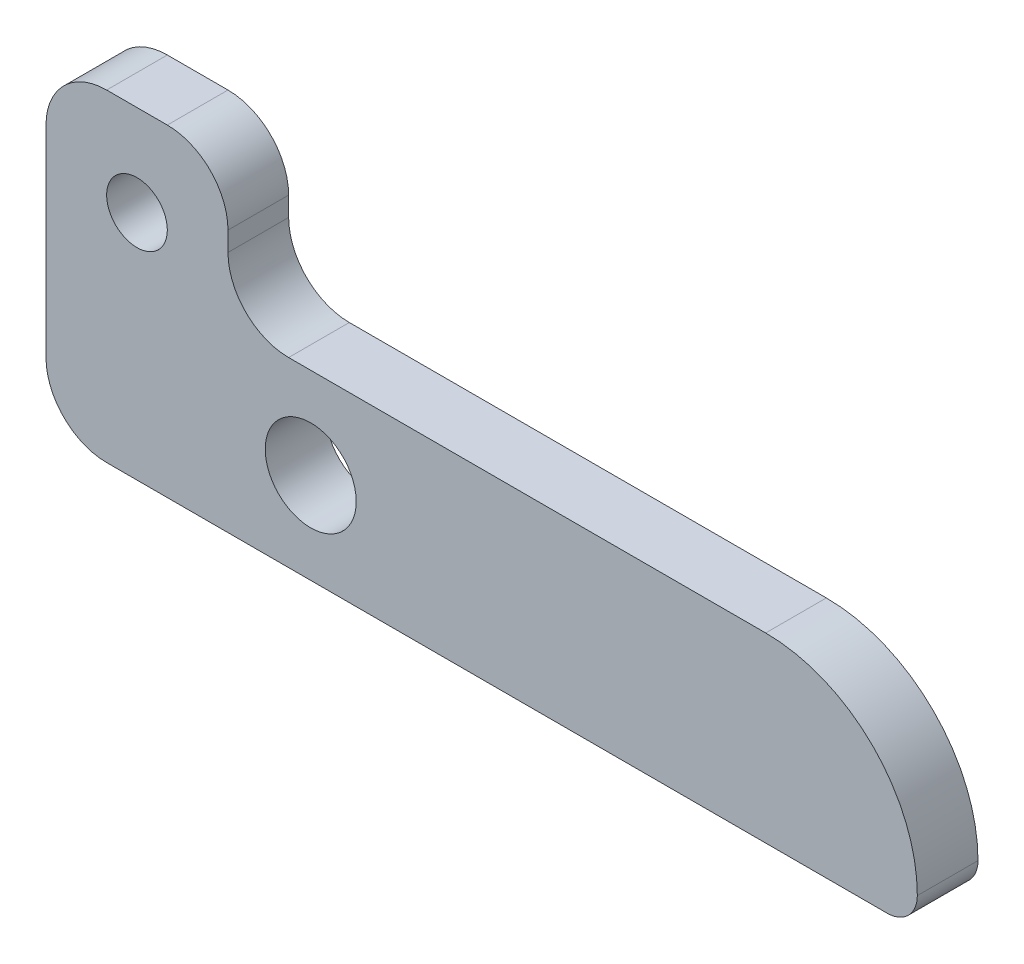
ISO-10303-21;
HEADER;
FILE_DESCRIPTION(('STEP AP214'),'2;1');
FILE_NAME('part.step','',(''),(''),'','','');
FILE_SCHEMA(('AUTOMOTIVE_DESIGN { 1 0 10303 214 1 1 1 1 }'));
ENDSEC;
DATA;
#1=APPLICATION_CONTEXT('core data for automotive mechanical design processes');
#2=APPLICATION_PROTOCOL_DEFINITION('international standard','automotive_design',2000,#1);
#3=PRODUCT_CONTEXT('',#1,'mechanical');
#4=PRODUCT('Part','Part','',(#3));
#5=PRODUCT_RELATED_PRODUCT_CATEGORY('part','',(#4));
#6=PRODUCT_DEFINITION_FORMATION('','',#4);
#7=PRODUCT_DEFINITION_CONTEXT('part definition',#1,'design');
#8=PRODUCT_DEFINITION('design','',#6,#7);
#9=PRODUCT_DEFINITION_SHAPE('','',#8);
#10=(LENGTH_UNIT() NAMED_UNIT(*) SI_UNIT(.MILLI.,.METRE.));
#11=(NAMED_UNIT(*) PLANE_ANGLE_UNIT() SI_UNIT($,.RADIAN.));
#12=(NAMED_UNIT(*) SI_UNIT($,.STERADIAN.) SOLID_ANGLE_UNIT());
#13=UNCERTAINTY_MEASURE_WITH_UNIT(LENGTH_MEASURE(1.E-05),#10,'distance_accuracy_value','');
#14=(GEOMETRIC_REPRESENTATION_CONTEXT(3) GLOBAL_UNCERTAINTY_ASSIGNED_CONTEXT((#13)) GLOBAL_UNIT_ASSIGNED_CONTEXT((#10,
#11,#12)) REPRESENTATION_CONTEXT('',''));
#15=CARTESIAN_POINT('',(0.,0.,0.));
#16=DIRECTION('',(0.,0.,1.));
#17=DIRECTION('',(1.,0.,0.));
#18=AXIS2_PLACEMENT_3D('',#15,#16,#17);
#19=CARTESIAN_POINT('',(0.,0.,2.));
#20=DIRECTION('',(0.,0.,1.));
#21=DIRECTION('',(1.,0.,0.));
#22=AXIS2_PLACEMENT_3D('',#19,#20,#21);
#23=PLANE('',#22);
#24=CARTESIAN_POINT('',(0.559814768951123,166.712259216357,2.));
#25=DIRECTION('',(0.,0.,1.));
#26=DIRECTION('',(1.,0.,0.));
#27=AXIS2_PLACEMENT_3D('',#24,#25,#26);
#28=CIRCLE('',#27,1.5);
#29=CARTESIAN_POINT('',(2.05981476895112,166.712259216357,2.));
#30=VERTEX_POINT('',#29);
#31=EDGE_CURVE('E217',#30,#30,#28,.T.);
#32=ORIENTED_EDGE('',*,*,#31,.F.);
#33=EDGE_LOOP('',(#32));
#34=FACE_BOUND('',#33,.T.);
#35=DIRECTION('',(0.,1.,0.));
#36=VECTOR('',#35,1.);
#37=CARTESIAN_POINT('',(-2.16775096698678,169.712259216357,2.));
#38=LINE('',#37,#36);
#39=CARTESIAN_POINT('',(-2.16775096698678,171.712259216357,2.));
#40=VERTEX_POINT('',#39);
#41=CARTESIAN_POINT('',(-2.16775096698678,172.350350498395,2.));
#42=VERTEX_POINT('',#41);
#43=EDGE_CURVE('E211',#40,#42,#38,.T.);
#44=ORIENTED_EDGE('',*,*,#43,.T.);
#45=CARTESIAN_POINT('',(-4.16775096698678,172.350350498395,2.));
#46=DIRECTION('',(0.,0.,1.));
#47=DIRECTION('',(1.,0.,0.));
#48=AXIS2_PLACEMENT_3D('',#45,#46,#47);
#49=CIRCLE('',#48,2.);
#50=CARTESIAN_POINT('',(-4.16775096698678,174.350350498395,2.));
#51=VERTEX_POINT('',#50);
#52=EDGE_CURVE('E187',#42,#51,#49,.T.);
#53=ORIENTED_EDGE('',*,*,#52,.T.);
#54=DIRECTION('',(-1.,0.,0.));
#55=VECTOR('',#54,1.);
#56=CARTESIAN_POINT('',(-2.16775096698678,174.350350498395,2.));
#57=LINE('',#56,#55);
#58=CARTESIAN_POINT('',(-6.16775096698678,174.350350498395,2.));
#59=VERTEX_POINT('',#58);
#60=EDGE_CURVE('E137',#51,#59,#57,.T.);
#61=ORIENTED_EDGE('',*,*,#60,.T.);
#62=CARTESIAN_POINT('',(-6.16775096698678,172.350350498395,2.));
#63=DIRECTION('',(0.,0.,1.));
#64=DIRECTION('',(1.,0.,0.));
#65=AXIS2_PLACEMENT_3D('',#62,#63,#64);
#66=CIRCLE('',#65,2.);
#67=CARTESIAN_POINT('',(-8.16775096698678,172.350350498395,2.));
#68=VERTEX_POINT('',#67);
#69=EDGE_CURVE('E55',#59,#68,#66,.T.);
#70=ORIENTED_EDGE('',*,*,#69,.T.);
#71=DIRECTION('',(0.,-1.,0.));
#72=VECTOR('',#71,1.);
#73=CARTESIAN_POINT('',(-8.16775096698678,174.350350498395,2.));
#74=LINE('',#73,#72);
#75=CARTESIAN_POINT('',(-8.16775096698677,165.712259216357,2.));
#76=VERTEX_POINT('',#75);
#77=EDGE_CURVE('E154',#68,#76,#74,.T.);
#78=ORIENTED_EDGE('',*,*,#77,.T.);
#79=CARTESIAN_POINT('',(-6.16775096698677,165.712259216357,2.));
#80=DIRECTION('',(0.,0.,1.));
#81=DIRECTION('',(1.,0.,0.));
#82=AXIS2_PLACEMENT_3D('',#79,#80,#81);
#83=CIRCLE('',#82,2.);
#84=CARTESIAN_POINT('',(-6.16775096698677,163.712259216357,2.));
#85=VERTEX_POINT('',#84);
#86=EDGE_CURVE('E184',#76,#85,#83,.T.);
#87=ORIENTED_EDGE('',*,*,#86,.T.);
#88=DIRECTION('',(1.,0.,0.));
#89=VECTOR('',#88,1.);
#90=CARTESIAN_POINT('',(-8.16775096698677,163.712259216357,2.));
#91=LINE('',#90,#89);
#92=CARTESIAN_POINT('',(19.5598147689511,163.712259216357,2.));
#93=VERTEX_POINT('',#92);
#94=EDGE_CURVE('E200',#85,#93,#91,.T.);
#95=ORIENTED_EDGE('',*,*,#94,.T.);
#96=CARTESIAN_POINT('',(19.5598147689511,164.712259216357,2.));
#97=DIRECTION('',(0.,0.,1.));
#98=DIRECTION('',(1.,0.,0.));
#99=AXIS2_PLACEMENT_3D('',#96,#97,#98);
#100=CIRCLE('',#99,1.);
#101=CARTESIAN_POINT('',(20.5598147689511,164.712259216357,2.));
#102=VERTEX_POINT('',#101);
#103=EDGE_CURVE('E164',#93,#102,#100,.T.);
#104=ORIENTED_EDGE('',*,*,#103,.T.);
#105=CARTESIAN_POINT('',(15.5598147689511,164.712259216357,2.));
#106=DIRECTION('',(0.,0.,1.));
#107=DIRECTION('',(1.,0.,0.));
#108=AXIS2_PLACEMENT_3D('',#105,#106,#107);
#109=CIRCLE('',#108,5.);
#110=CARTESIAN_POINT('',(15.5598147689511,169.712259216357,2.));
#111=VERTEX_POINT('',#110);
#112=EDGE_CURVE('E157',#102,#111,#109,.T.);
#113=ORIENTED_EDGE('',*,*,#112,.T.);
#114=DIRECTION('',(-1.,0.,0.));
#115=VECTOR('',#114,1.);
#116=CARTESIAN_POINT('',(20.5598147689511,169.712259216357,2.));
#117=LINE('',#116,#115);
#118=CARTESIAN_POINT('',(-0.167750966986777,169.712259216357,2.));
#119=VERTEX_POINT('',#118);
#120=EDGE_CURVE('E136',#111,#119,#117,.T.);
#121=ORIENTED_EDGE('',*,*,#120,.T.);
#122=CARTESIAN_POINT('',(-0.167750966986778,171.712259216357,2.));
#123=DIRECTION('',(0.,0.,1.));
#124=DIRECTION('',(1.,0.,0.));
#125=AXIS2_PLACEMENT_3D('',#122,#123,#124);
#126=CIRCLE('',#125,2.);
#127=EDGE_CURVE('E11',#119,#40,#126,.F.);
#128=ORIENTED_EDGE('',*,*,#127,.T.);
#129=EDGE_LOOP('',(#44,#53,#61,#70,#78,#87,#95,#104,#113,#121,#128));
#130=FACE_BOUND('',#129,.T.);
#131=CARTESIAN_POINT('',(-5.16775096698678,171.350350498395,2.));
#132=DIRECTION('',(0.,0.,1.));
#133=DIRECTION('',(1.,0.,0.));
#134=AXIS2_PLACEMENT_3D('',#131,#132,#133);
#135=CIRCLE('',#134,1.00000000000003);
#136=CARTESIAN_POINT('',(-4.16775096698675,171.350350498395,2.));
#137=VERTEX_POINT('',#136);
#138=EDGE_CURVE('E224',#137,#137,#135,.T.);
#139=ORIENTED_EDGE('',*,*,#138,.F.);
#140=EDGE_LOOP('',(#139));
#141=FACE_BOUND('',#140,.T.);
#142=ADVANCED_FACE('F33',(#34,#130,#141),#23,.T.);
#143=CARTESIAN_POINT('',(0.,0.,0.));
#144=DIRECTION('',(0.,0.,1.));
#145=DIRECTION('',(1.,0.,0.));
#146=AXIS2_PLACEMENT_3D('',#143,#144,#145);
#147=PLANE('',#146);
#148=DIRECTION('',(-1.,0.,0.));
#149=VECTOR('',#148,1.);
#150=CARTESIAN_POINT('',(-2.16775096698678,174.350350498395,0.));
#151=LINE('',#150,#149);
#152=CARTESIAN_POINT('',(-4.16775096698678,174.350350498395,0.));
#153=VERTEX_POINT('',#152);
#154=CARTESIAN_POINT('',(-6.16775096698678,174.350350498395,0.));
#155=VERTEX_POINT('',#154);
#156=EDGE_CURVE('E147',#153,#155,#151,.T.);
#157=ORIENTED_EDGE('',*,*,#156,.F.);
#158=CARTESIAN_POINT('',(-4.16775096698678,172.350350498395,0.));
#159=DIRECTION('',(0.,0.,1.));
#160=DIRECTION('',(1.,0.,0.));
#161=AXIS2_PLACEMENT_3D('',#158,#159,#160);
#162=CIRCLE('',#161,2.);
#163=CARTESIAN_POINT('',(-2.16775096698678,172.350350498395,0.));
#164=VERTEX_POINT('',#163);
#165=EDGE_CURVE('E182',#153,#164,#162,.F.);
#166=ORIENTED_EDGE('',*,*,#165,.T.);
#167=DIRECTION('',(0.,1.,0.));
#168=VECTOR('',#167,1.);
#169=CARTESIAN_POINT('',(-2.16775096698678,169.712259216357,0.));
#170=LINE('',#169,#168);
#171=CARTESIAN_POINT('',(-2.16775096698678,171.712259216357,0.));
#172=VERTEX_POINT('',#171);
#173=EDGE_CURVE('E143',#172,#164,#170,.T.);
#174=ORIENTED_EDGE('',*,*,#173,.F.);
#175=CARTESIAN_POINT('',(-0.167750966986778,171.712259216357,0.));
#176=DIRECTION('',(0.,0.,1.));
#177=DIRECTION('',(1.,0.,0.));
#178=AXIS2_PLACEMENT_3D('',#175,#176,#177);
#179=CIRCLE('',#178,2.);
#180=CARTESIAN_POINT('',(-0.167750966986777,169.712259216357,0.));
#181=VERTEX_POINT('',#180);
#182=EDGE_CURVE('E41',#172,#181,#179,.T.);
#183=ORIENTED_EDGE('',*,*,#182,.T.);
#184=DIRECTION('',(-1.,0.,0.));
#185=VECTOR('',#184,1.);
#186=CARTESIAN_POINT('',(20.5598147689511,169.712259216357,0.));
#187=LINE('',#186,#185);
#188=CARTESIAN_POINT('',(15.5598147689511,169.712259216357,0.));
#189=VERTEX_POINT('',#188);
#190=EDGE_CURVE('E133',#189,#181,#187,.T.);
#191=ORIENTED_EDGE('',*,*,#190,.F.);
#192=CARTESIAN_POINT('',(15.5598147689511,164.712259216357,0.));
#193=DIRECTION('',(0.,0.,1.));
#194=DIRECTION('',(1.,0.,0.));
#195=AXIS2_PLACEMENT_3D('',#192,#193,#194);
#196=CIRCLE('',#195,5.);
#197=CARTESIAN_POINT('',(20.5598147689511,164.712259216357,0.));
#198=VERTEX_POINT('',#197);
#199=EDGE_CURVE('E118',#189,#198,#196,.F.);
#200=ORIENTED_EDGE('',*,*,#199,.T.);
#201=CARTESIAN_POINT('',(19.5598147689511,164.712259216357,0.));
#202=DIRECTION('',(0.,0.,1.));
#203=DIRECTION('',(1.,0.,0.));
#204=AXIS2_PLACEMENT_3D('',#201,#202,#203);
#205=CIRCLE('',#204,1.);
#206=CARTESIAN_POINT('',(19.5598147689511,163.712259216357,0.));
#207=VERTEX_POINT('',#206);
#208=EDGE_CURVE('E159',#198,#207,#205,.F.);
#209=ORIENTED_EDGE('',*,*,#208,.T.);
#210=DIRECTION('',(1.,0.,0.));
#211=VECTOR('',#210,1.);
#212=CARTESIAN_POINT('',(0.596545218638145,163.712259216357,0.));
#213=LINE('',#212,#211);
#214=CARTESIAN_POINT('',(-6.16775096698677,163.712259216357,0.));
#215=VERTEX_POINT('',#214);
#216=EDGE_CURVE('E144',#215,#207,#213,.T.);
#217=ORIENTED_EDGE('',*,*,#216,.F.);
#218=CARTESIAN_POINT('',(-6.16775096698677,165.712259216357,0.));
#219=DIRECTION('',(0.,0.,1.));
#220=DIRECTION('',(1.,0.,0.));
#221=AXIS2_PLACEMENT_3D('',#218,#219,#220);
#222=CIRCLE('',#221,2.);
#223=CARTESIAN_POINT('',(-8.16775096698677,165.712259216357,0.));
#224=VERTEX_POINT('',#223);
#225=EDGE_CURVE('E178',#215,#224,#222,.F.);
#226=ORIENTED_EDGE('',*,*,#225,.T.);
#227=DIRECTION('',(0.,-1.,0.));
#228=VECTOR('',#227,1.);
#229=CARTESIAN_POINT('',(-8.16775096698678,174.350350498395,0.));
#230=LINE('',#229,#228);
#231=CARTESIAN_POINT('',(-8.16775096698678,172.350350498395,0.));
#232=VERTEX_POINT('',#231);
#233=EDGE_CURVE('E149',#232,#224,#230,.T.);
#234=ORIENTED_EDGE('',*,*,#233,.F.);
#235=CARTESIAN_POINT('',(-6.16775096698678,172.350350498395,0.));
#236=DIRECTION('',(0.,0.,1.));
#237=DIRECTION('',(1.,0.,0.));
#238=AXIS2_PLACEMENT_3D('',#235,#236,#237);
#239=CIRCLE('',#238,2.);
#240=EDGE_CURVE('E180',#232,#155,#239,.F.);
#241=ORIENTED_EDGE('',*,*,#240,.T.);
#242=EDGE_LOOP('',(#157,#166,#174,#183,#191,#200,#209,#217,#226,#234,#241));
#243=FACE_BOUND('',#242,.T.);
#244=CARTESIAN_POINT('',(0.559814768951123,166.712259216357,0.));
#245=DIRECTION('',(0.,0.,1.));
#246=DIRECTION('',(1.,0.,0.));
#247=AXIS2_PLACEMENT_3D('',#244,#245,#246);
#248=CIRCLE('',#247,1.5);
#249=CARTESIAN_POINT('',(2.05981476895112,166.712259216357,0.));
#250=VERTEX_POINT('',#249);
#251=EDGE_CURVE('E219',#250,#250,#248,.T.);
#252=ORIENTED_EDGE('',*,*,#251,.T.);
#253=EDGE_LOOP('',(#252));
#254=FACE_BOUND('',#253,.T.);
#255=CARTESIAN_POINT('',(-5.16775096698678,171.350350498395,0.));
#256=DIRECTION('',(0.,0.,1.));
#257=DIRECTION('',(1.,0.,0.));
#258=AXIS2_PLACEMENT_3D('',#255,#256,#257);
#259=CIRCLE('',#258,1.00000000000003);
#260=CARTESIAN_POINT('',(-4.16775096698675,171.350350498395,0.));
#261=VERTEX_POINT('',#260);
#262=EDGE_CURVE('E226',#261,#261,#259,.T.);
#263=ORIENTED_EDGE('',*,*,#262,.T.);
#264=EDGE_LOOP('',(#263));
#265=FACE_BOUND('',#264,.T.);
#266=ADVANCED_FACE('F140',(#243,#254,#265),#147,.F.);
#267=CARTESIAN_POINT('',(-8.16775096698678,174.350350498395,2.));
#268=DIRECTION('',(1.,0.,0.));
#269=DIRECTION('',(0.,1.,0.));
#270=AXIS2_PLACEMENT_3D('',#267,#268,#269);
#271=PLANE('',#270);
#272=ORIENTED_EDGE('',*,*,#77,.F.);
#273=DIRECTION('',(0.,0.,-1.));
#274=VECTOR('',#273,1.);
#275=CARTESIAN_POINT('',(-8.16775096698678,172.350350498395,2.));
#276=LINE('',#275,#274);
#277=EDGE_CURVE('E190',#68,#232,#276,.T.);
#278=ORIENTED_EDGE('',*,*,#277,.T.);
#279=ORIENTED_EDGE('',*,*,#233,.T.);
#280=DIRECTION('',(0.,0.,-1.));
#281=VECTOR('',#280,1.);
#282=CARTESIAN_POINT('',(-8.16775096698677,165.712259216357,2.));
#283=LINE('',#282,#281);
#284=EDGE_CURVE('E48',#224,#76,#283,.F.);
#285=ORIENTED_EDGE('',*,*,#284,.T.);
#286=EDGE_LOOP('',(#272,#278,#279,#285));
#287=FACE_BOUND('',#286,.T.);
#288=ADVANCED_FACE('F240',(#287),#271,.F.);
#289=CARTESIAN_POINT('',(0.596545218638145,163.712259216357,2.));
#290=DIRECTION('',(0.,1.,0.));
#291=DIRECTION('',(0.,0.,1.));
#292=AXIS2_PLACEMENT_3D('',#289,#290,#291);
#293=PLANE('',#292);
#294=ORIENTED_EDGE('',*,*,#94,.F.);
#295=DIRECTION('',(0.,0.,-1.));
#296=VECTOR('',#295,1.);
#297=CARTESIAN_POINT('',(-6.16775096698677,163.712259216357,2.));
#298=LINE('',#297,#296);
#299=EDGE_CURVE('E193',#85,#215,#298,.T.);
#300=ORIENTED_EDGE('',*,*,#299,.T.);
#301=ORIENTED_EDGE('',*,*,#216,.T.);
#302=DIRECTION('',(0.,0.,-1.));
#303=VECTOR('',#302,1.);
#304=CARTESIAN_POINT('',(19.5598147689511,163.712259216357,2.));
#305=LINE('',#304,#303);
#306=EDGE_CURVE('E161',#207,#93,#305,.F.);
#307=ORIENTED_EDGE('',*,*,#306,.T.);
#308=EDGE_LOOP('',(#294,#300,#301,#307));
#309=FACE_BOUND('',#308,.T.);
#310=ADVANCED_FACE('F199',(#309),#293,.F.);
#311=CARTESIAN_POINT('',(20.5598147689511,169.712259216357,2.));
#312=DIRECTION('',(0.,-1.,0.));
#313=DIRECTION('',(0.,0.,-1.));
#314=AXIS2_PLACEMENT_3D('',#311,#312,#313);
#315=PLANE('',#314);
#316=ORIENTED_EDGE('',*,*,#190,.T.);
#317=DIRECTION('',(0.,0.,-1.));
#318=VECTOR('',#317,1.);
#319=CARTESIAN_POINT('',(-0.167750966986778,169.712259216357,2.));
#320=LINE('',#319,#318);
#321=EDGE_CURVE('E171',#181,#119,#320,.F.);
#322=ORIENTED_EDGE('',*,*,#321,.T.);
#323=ORIENTED_EDGE('',*,*,#120,.F.);
#324=DIRECTION('',(0.,0.,-1.));
#325=VECTOR('',#324,1.);
#326=CARTESIAN_POINT('',(15.5598147689511,169.712259216357,2.));
#327=LINE('',#326,#325);
#328=EDGE_CURVE('E122',#111,#189,#327,.T.);
#329=ORIENTED_EDGE('',*,*,#328,.T.);
#330=EDGE_LOOP('',(#316,#322,#323,#329));
#331=FACE_BOUND('',#330,.T.);
#332=ADVANCED_FACE('F132',(#331),#315,.F.);
#333=CARTESIAN_POINT('',(-2.16775096698678,169.712259216357,2.));
#334=DIRECTION('',(-1.,0.,0.));
#335=DIRECTION('',(0.,-1.,0.));
#336=AXIS2_PLACEMENT_3D('',#333,#334,#335);
#337=PLANE('',#336);
#338=ORIENTED_EDGE('',*,*,#43,.F.);
#339=DIRECTION('',(0.,0.,-1.));
#340=VECTOR('',#339,1.);
#341=CARTESIAN_POINT('',(-2.16775096698678,171.712259216357,0.));
#342=LINE('',#341,#340);
#343=EDGE_CURVE('E168',#40,#172,#342,.T.);
#344=ORIENTED_EDGE('',*,*,#343,.T.);
#345=ORIENTED_EDGE('',*,*,#173,.T.);
#346=DIRECTION('',(0.,0.,-1.));
#347=VECTOR('',#346,1.);
#348=CARTESIAN_POINT('',(-2.16775096698678,172.350350498395,2.));
#349=LINE('',#348,#347);
#350=EDGE_CURVE('E166',#164,#42,#349,.F.);
#351=ORIENTED_EDGE('',*,*,#350,.T.);
#352=EDGE_LOOP('',(#338,#344,#345,#351));
#353=FACE_BOUND('',#352,.T.);
#354=ADVANCED_FACE('F249',(#353),#337,.F.);
#355=CARTESIAN_POINT('',(-2.16775096698678,174.350350498395,2.));
#356=DIRECTION('',(0.,-1.,0.));
#357=DIRECTION('',(0.,0.,-1.));
#358=AXIS2_PLACEMENT_3D('',#355,#356,#357);
#359=PLANE('',#358);
#360=ORIENTED_EDGE('',*,*,#60,.F.);
#361=DIRECTION('',(0.,0.,-1.));
#362=VECTOR('',#361,1.);
#363=CARTESIAN_POINT('',(-4.16775096698678,174.350350498395,2.));
#364=LINE('',#363,#362);
#365=EDGE_CURVE('E175',#51,#153,#364,.T.);
#366=ORIENTED_EDGE('',*,*,#365,.T.);
#367=ORIENTED_EDGE('',*,*,#156,.T.);
#368=DIRECTION('',(0.,0.,-1.));
#369=VECTOR('',#368,1.);
#370=CARTESIAN_POINT('',(-6.16775096698678,174.350350498395,2.));
#371=LINE('',#370,#369);
#372=EDGE_CURVE('E173',#155,#59,#371,.F.);
#373=ORIENTED_EDGE('',*,*,#372,.T.);
#374=EDGE_LOOP('',(#360,#366,#367,#373));
#375=FACE_BOUND('',#374,.T.);
#376=ADVANCED_FACE('F246',(#375),#359,.F.);
#377=CARTESIAN_POINT('',(0.559814768951123,166.712259216357,2.));
#378=DIRECTION('',(0.,0.,-1.));
#379=DIRECTION('',(-1.,0.,0.));
#380=AXIS2_PLACEMENT_3D('',#377,#378,#379);
#381=CYLINDRICAL_SURFACE('',#380,1.5);
#382=ORIENTED_EDGE('',*,*,#31,.T.);
#383=EDGE_LOOP('',(#382));
#384=FACE_BOUND('',#383,.T.);
#385=ORIENTED_EDGE('',*,*,#251,.F.);
#386=EDGE_LOOP('',(#385));
#387=FACE_BOUND('',#386,.T.);
#388=ADVANCED_FACE('F243',(#384,#387),#381,.F.);
#389=CARTESIAN_POINT('',(-5.16775096698678,171.350350498395,2.));
#390=DIRECTION('',(0.,0.,-1.));
#391=DIRECTION('',(-1.,0.,0.));
#392=AXIS2_PLACEMENT_3D('',#389,#390,#391);
#393=CYLINDRICAL_SURFACE('',#392,1.00000000000003);
#394=ORIENTED_EDGE('',*,*,#138,.T.);
#395=EDGE_LOOP('',(#394));
#396=FACE_BOUND('',#395,.T.);
#397=ORIENTED_EDGE('',*,*,#262,.F.);
#398=EDGE_LOOP('',(#397));
#399=FACE_BOUND('',#398,.T.);
#400=ADVANCED_FACE('F232',(#396,#399),#393,.F.);
#401=CARTESIAN_POINT('',(15.5598147689511,164.712259216357,2.));
#402=DIRECTION('',(0.,0.,-1.));
#403=DIRECTION('',(-1.,0.,0.));
#404=AXIS2_PLACEMENT_3D('',#401,#402,#403);
#405=CYLINDRICAL_SURFACE('',#404,5.);
#406=ORIENTED_EDGE('',*,*,#112,.F.);
#407=DIRECTION('',(0.,0.,-1.));
#408=VECTOR('',#407,1.);
#409=CARTESIAN_POINT('',(20.5598147689511,164.712259216357,2.));
#410=LINE('',#409,#408);
#411=EDGE_CURVE('E124',#198,#102,#410,.F.);
#412=ORIENTED_EDGE('',*,*,#411,.F.);
#413=ORIENTED_EDGE('',*,*,#199,.F.);
#414=ORIENTED_EDGE('',*,*,#328,.F.);
#415=EDGE_LOOP('',(#406,#412,#413,#414));
#416=FACE_BOUND('',#415,.T.);
#417=ADVANCED_FACE('F121',(#416),#405,.T.);
#418=CARTESIAN_POINT('',(19.5598147689511,164.712259216357,2.));
#419=DIRECTION('',(0.,0.,-1.));
#420=DIRECTION('',(-1.,0.,0.));
#421=AXIS2_PLACEMENT_3D('',#418,#419,#420);
#422=CYLINDRICAL_SURFACE('',#421,1.);
#423=ORIENTED_EDGE('',*,*,#103,.F.);
#424=ORIENTED_EDGE('',*,*,#306,.F.);
#425=ORIENTED_EDGE('',*,*,#208,.F.);
#426=ORIENTED_EDGE('',*,*,#411,.T.);
#427=EDGE_LOOP('',(#423,#424,#425,#426));
#428=FACE_BOUND('',#427,.T.);
#429=ADVANCED_FACE('F207',(#428),#422,.T.);
#430=CARTESIAN_POINT('',(-0.167750966986778,171.712259216357,2.));
#431=DIRECTION('',(0.,0.,1.));
#432=DIRECTION('',(1.,0.,0.));
#433=AXIS2_PLACEMENT_3D('',#430,#431,#432);
#434=CYLINDRICAL_SURFACE('',#433,2.);
#435=ORIENTED_EDGE('',*,*,#127,.F.);
#436=ORIENTED_EDGE('',*,*,#321,.F.);
#437=ORIENTED_EDGE('',*,*,#182,.F.);
#438=ORIENTED_EDGE('',*,*,#343,.F.);
#439=EDGE_LOOP('',(#435,#436,#437,#438));
#440=FACE_BOUND('',#439,.T.);
#441=ADVANCED_FACE('F264',(#440),#434,.F.);
#442=CARTESIAN_POINT('',(-4.16775096698678,172.350350498395,2.));
#443=DIRECTION('',(0.,0.,-1.));
#444=DIRECTION('',(-1.,0.,0.));
#445=AXIS2_PLACEMENT_3D('',#442,#443,#444);
#446=CYLINDRICAL_SURFACE('',#445,2.);
#447=ORIENTED_EDGE('',*,*,#52,.F.);
#448=ORIENTED_EDGE('',*,*,#350,.F.);
#449=ORIENTED_EDGE('',*,*,#165,.F.);
#450=ORIENTED_EDGE('',*,*,#365,.F.);
#451=EDGE_LOOP('',(#447,#448,#449,#450));
#452=FACE_BOUND('',#451,.T.);
#453=ADVANCED_FACE('F267',(#452),#446,.T.);
#454=CARTESIAN_POINT('',(-6.16775096698678,172.350350498395,2.));
#455=DIRECTION('',(0.,0.,-1.));
#456=DIRECTION('',(-1.,0.,0.));
#457=AXIS2_PLACEMENT_3D('',#454,#455,#456);
#458=CYLINDRICAL_SURFACE('',#457,2.);
#459=ORIENTED_EDGE('',*,*,#69,.F.);
#460=ORIENTED_EDGE('',*,*,#372,.F.);
#461=ORIENTED_EDGE('',*,*,#240,.F.);
#462=ORIENTED_EDGE('',*,*,#277,.F.);
#463=EDGE_LOOP('',(#459,#460,#461,#462));
#464=FACE_BOUND('',#463,.T.);
#465=ADVANCED_FACE('F270',(#464),#458,.T.);
#466=CARTESIAN_POINT('',(-6.16775096698677,165.712259216357,2.));
#467=DIRECTION('',(0.,0.,-1.));
#468=DIRECTION('',(-1.,0.,0.));
#469=AXIS2_PLACEMENT_3D('',#466,#467,#468);
#470=CYLINDRICAL_SURFACE('',#469,2.);
#471=ORIENTED_EDGE('',*,*,#86,.F.);
#472=ORIENTED_EDGE('',*,*,#284,.F.);
#473=ORIENTED_EDGE('',*,*,#225,.F.);
#474=ORIENTED_EDGE('',*,*,#299,.F.);
#475=EDGE_LOOP('',(#471,#472,#473,#474));
#476=FACE_BOUND('',#475,.T.);
#477=ADVANCED_FACE('F35',(#476),#470,.T.);
#478=CLOSED_SHELL('',(#142,#266,#288,#310,#332,#354,#376,#388,#400,#417,#429,#441,#453,#465,#477));
#479=MANIFOLD_SOLID_BREP('B2',#478);
#480=ADVANCED_BREP_SHAPE_REPRESENTATION('',(#18,#479),#14);
#481=SHAPE_DEFINITION_REPRESENTATION(#9,#480);
ENDSEC;
END-ISO-10303-21;
